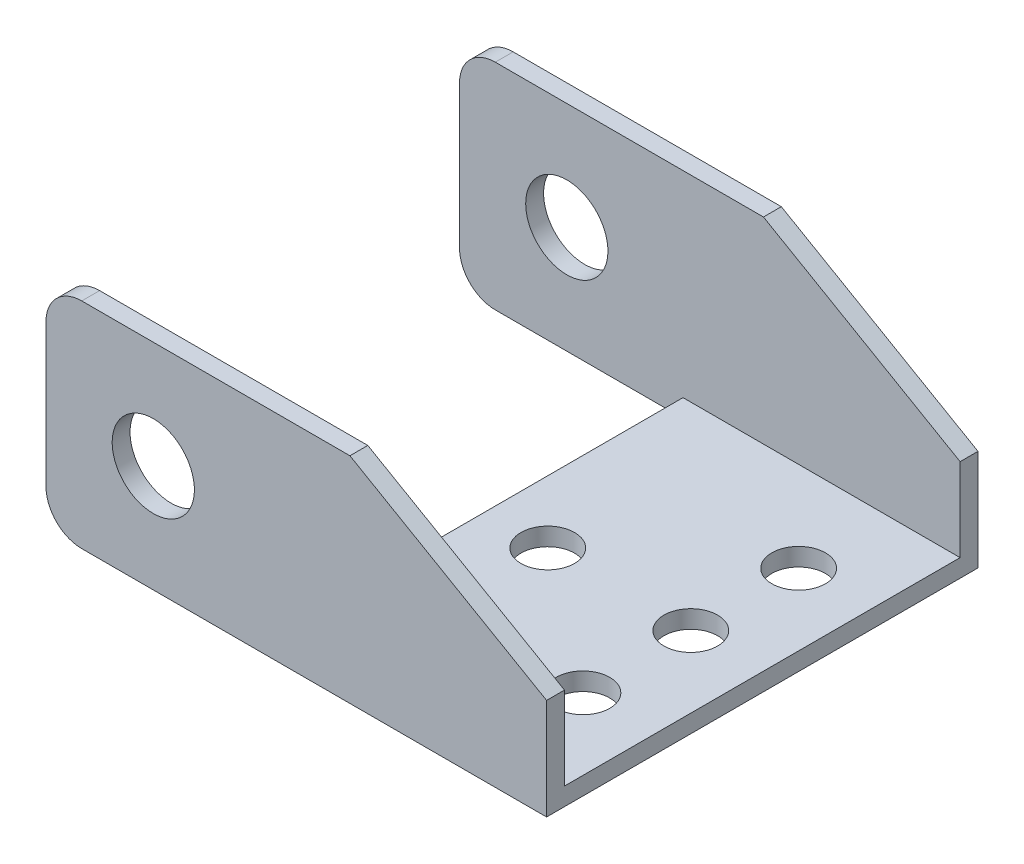
ISO-10303-21;
HEADER;
FILE_DESCRIPTION(('STEP AP214'),'2;1');
FILE_NAME('part.step','',(''),(''),'','','');
FILE_SCHEMA(('AUTOMOTIVE_DESIGN { 1 0 10303 214 1 1 1 1 }'));
ENDSEC;
DATA;
#1=APPLICATION_CONTEXT('core data for automotive mechanical design processes');
#2=APPLICATION_PROTOCOL_DEFINITION('international standard','automotive_design',2000,#1);
#3=PRODUCT_CONTEXT('',#1,'mechanical');
#4=PRODUCT('Part','Part','',(#3));
#5=PRODUCT_RELATED_PRODUCT_CATEGORY('part','',(#4));
#6=PRODUCT_DEFINITION_FORMATION('','',#4);
#7=PRODUCT_DEFINITION_CONTEXT('part definition',#1,'design');
#8=PRODUCT_DEFINITION('design','',#6,#7);
#9=PRODUCT_DEFINITION_SHAPE('','',#8);
#10=(LENGTH_UNIT() NAMED_UNIT(*) SI_UNIT(.MILLI.,.METRE.));
#11=(NAMED_UNIT(*) PLANE_ANGLE_UNIT() SI_UNIT($,.RADIAN.));
#12=(NAMED_UNIT(*) SI_UNIT($,.STERADIAN.) SOLID_ANGLE_UNIT());
#13=UNCERTAINTY_MEASURE_WITH_UNIT(LENGTH_MEASURE(1.E-05),#10,'distance_accuracy_value','');
#14=(GEOMETRIC_REPRESENTATION_CONTEXT(3) GLOBAL_UNCERTAINTY_ASSIGNED_CONTEXT((#13)) GLOBAL_UNIT_ASSIGNED_CONTEXT((#10,
#11,#12)) REPRESENTATION_CONTEXT('',''));
#15=CARTESIAN_POINT('',(0.,0.,0.));
#16=DIRECTION('',(0.,0.,1.));
#17=DIRECTION('',(1.,0.,0.));
#18=AXIS2_PLACEMENT_3D('',#15,#16,#17);
#19=CARTESIAN_POINT('',(0.,0.,12.065));
#20=DIRECTION('',(0.,0.,-1.));
#21=DIRECTION('',(-1.,0.,0.));
#22=AXIS2_PLACEMENT_3D('',#19,#20,#21);
#23=CYLINDRICAL_SURFACE('',#22,2.3);
#24=CARTESIAN_POINT('',(0.,0.,-11.065));
#25=DIRECTION('',(0.,0.,-1.));
#26=DIRECTION('',(-1.,0.,0.));
#27=AXIS2_PLACEMENT_3D('',#24,#25,#26);
#28=CIRCLE('',#27,2.3);
#29=CARTESIAN_POINT('',(-2.3,0.,-11.065));
#30=VERTEX_POINT('',#29);
#31=EDGE_CURVE('E361',#30,#30,#28,.F.);
#32=ORIENTED_EDGE('',*,*,#31,.T.);
#33=EDGE_LOOP('',(#32));
#34=FACE_BOUND('',#33,.T.);
#35=CARTESIAN_POINT('',(0.,0.,-12.065));
#36=DIRECTION('',(0.,0.,-1.));
#37=DIRECTION('',(-1.,0.,0.));
#38=AXIS2_PLACEMENT_3D('',#35,#36,#37);
#39=CIRCLE('',#38,2.3);
#40=CARTESIAN_POINT('',(-2.3,0.,-12.065));
#41=VERTEX_POINT('',#40);
#42=EDGE_CURVE('E264',#41,#41,#39,.F.);
#43=ORIENTED_EDGE('',*,*,#42,.F.);
#44=EDGE_LOOP('',(#43));
#45=FACE_BOUND('',#44,.T.);
#46=ADVANCED_FACE('F14',(#34,#45),#23,.F.);
#47=CARTESIAN_POINT('',(-4.,4.,12.065));
#48=DIRECTION('',(0.,0.,-1.));
#49=DIRECTION('',(-1.,0.,0.));
#50=AXIS2_PLACEMENT_3D('',#47,#48,#49);
#51=CYLINDRICAL_SURFACE('',#50,2.);
#52=CARTESIAN_POINT('',(-4.,4.,-12.065));
#53=DIRECTION('',(0.,0.,-1.));
#54=DIRECTION('',(-1.,0.,0.));
#55=AXIS2_PLACEMENT_3D('',#52,#53,#54);
#56=CIRCLE('',#55,2.);
#57=CARTESIAN_POINT('',(-6.,4.,-12.065));
#58=VERTEX_POINT('',#57);
#59=CARTESIAN_POINT('',(-4.,6.,-12.065));
#60=VERTEX_POINT('',#59);
#61=EDGE_CURVE('E97',#58,#60,#56,.T.);
#62=ORIENTED_EDGE('',*,*,#61,.F.);
#63=DIRECTION('',(0.,0.,-1.));
#64=VECTOR('',#63,1.);
#65=CARTESIAN_POINT('',(-6.,4.,12.065));
#66=LINE('',#65,#64);
#67=CARTESIAN_POINT('',(-6.,4.,-11.065));
#68=VERTEX_POINT('',#67);
#69=EDGE_CURVE('E90',#58,#68,#66,.F.);
#70=ORIENTED_EDGE('',*,*,#69,.T.);
#71=CARTESIAN_POINT('',(-4.,4.,-11.065));
#72=DIRECTION('',(0.,0.,-1.));
#73=DIRECTION('',(-1.,0.,0.));
#74=AXIS2_PLACEMENT_3D('',#71,#72,#73);
#75=CIRCLE('',#74,2.);
#76=CARTESIAN_POINT('',(-4.,6.,-11.065));
#77=VERTEX_POINT('',#76);
#78=EDGE_CURVE('E359',#68,#77,#75,.T.);
#79=ORIENTED_EDGE('',*,*,#78,.T.);
#80=DIRECTION('',(0.,0.,-1.));
#81=VECTOR('',#80,1.);
#82=CARTESIAN_POINT('',(-4.,6.,12.065));
#83=LINE('',#82,#81);
#84=EDGE_CURVE('E255',#77,#60,#83,.T.);
#85=ORIENTED_EDGE('',*,*,#84,.T.);
#86=EDGE_LOOP('',(#62,#70,#79,#85));
#87=FACE_BOUND('',#86,.T.);
#88=ADVANCED_FACE('F246',(#87),#51,.T.);
#89=CARTESIAN_POINT('',(-6.,6.,12.065));
#90=DIRECTION('',(0.,-1.,0.));
#91=DIRECTION('',(0.,0.,-1.));
#92=AXIS2_PLACEMENT_3D('',#89,#90,#91);
#93=PLANE('',#92);
#94=ORIENTED_EDGE('',*,*,#84,.F.);
#95=DIRECTION('',(-1.,0.,0.));
#96=VECTOR('',#95,1.);
#97=CARTESIAN_POINT('',(-6.,6.,-11.065));
#98=LINE('',#97,#96);
#99=CARTESIAN_POINT('',(11.,6.00000000000001,-11.065));
#100=VERTEX_POINT('',#99);
#101=EDGE_CURVE('E329',#77,#100,#98,.F.);
#102=ORIENTED_EDGE('',*,*,#101,.T.);
#103=DIRECTION('',(0.,0.,1.));
#104=VECTOR('',#103,1.);
#105=CARTESIAN_POINT('',(11.,6.,12.065));
#106=LINE('',#105,#104);
#107=CARTESIAN_POINT('',(11.,6.,-12.065));
#108=VERTEX_POINT('',#107);
#109=EDGE_CURVE('E319',#100,#108,#106,.F.);
#110=ORIENTED_EDGE('',*,*,#109,.T.);
#111=DIRECTION('',(-1.,0.,0.));
#112=VECTOR('',#111,1.);
#113=CARTESIAN_POINT('',(0.,6.,-12.065));
#114=LINE('',#113,#112);
#115=EDGE_CURVE('E101',#60,#108,#114,.F.);
#116=ORIENTED_EDGE('',*,*,#115,.F.);
#117=EDGE_LOOP('',(#94,#102,#110,#116));
#118=FACE_BOUND('',#117,.T.);
#119=ADVANCED_FACE('F243',(#118),#93,.F.);
#120=CARTESIAN_POINT('',(11.,6.,12.065));
#121=DIRECTION('',(-0.500000000000001,-0.866025403784438,0.));
#122=DIRECTION('',(0.866025403784438,-0.500000000000001,0.));
#123=AXIS2_PLACEMENT_3D('',#120,#121,#122);
#124=PLANE('',#123);
#125=DIRECTION('',(0.866025403784438,-0.500000000000001,0.));
#126=VECTOR('',#125,1.);
#127=CARTESIAN_POINT('',(11.,6.,-11.065));
#128=LINE('',#127,#126);
#129=CARTESIAN_POINT('',(22.,-0.350852961085902,-11.065));
#130=VERTEX_POINT('',#129);
#131=EDGE_CURVE('E324',#100,#130,#128,.T.);
#132=ORIENTED_EDGE('',*,*,#131,.T.);
#133=DIRECTION('',(0.,0.,1.));
#134=VECTOR('',#133,1.);
#135=CARTESIAN_POINT('',(22.,-0.350852961085901,12.065));
#136=LINE('',#135,#134);
#137=CARTESIAN_POINT('',(22.,-0.350852961085902,-12.065));
#138=VERTEX_POINT('',#137);
#139=EDGE_CURVE('E260',#130,#138,#136,.F.);
#140=ORIENTED_EDGE('',*,*,#139,.T.);
#141=DIRECTION('',(0.866025403784438,-0.500000000000001,0.));
#142=VECTOR('',#141,1.);
#143=CARTESIAN_POINT('',(11.,6.,-12.065));
#144=LINE('',#143,#142);
#145=EDGE_CURVE('E258',#108,#138,#144,.T.);
#146=ORIENTED_EDGE('',*,*,#145,.F.);
#147=ORIENTED_EDGE('',*,*,#109,.F.);
#148=EDGE_LOOP('',(#132,#140,#146,#147));
#149=FACE_BOUND('',#148,.T.);
#150=ADVANCED_FACE('F240',(#149),#124,.F.);
#151=CARTESIAN_POINT('',(-6.,-6.,12.065));
#152=DIRECTION('',(1.,0.,0.));
#153=DIRECTION('',(0.,0.,-1.));
#154=AXIS2_PLACEMENT_3D('',#151,#152,#153);
#155=PLANE('',#154);
#156=DIRECTION('',(0.,0.,-1.));
#157=VECTOR('',#156,1.);
#158=CARTESIAN_POINT('',(-6.,-4.,12.065));
#159=LINE('',#158,#157);
#160=CARTESIAN_POINT('',(-6.,-4.,-11.065));
#161=VERTEX_POINT('',#160);
#162=CARTESIAN_POINT('',(-6.,-4.,-12.065));
#163=VERTEX_POINT('',#162);
#164=EDGE_CURVE('E320',#161,#163,#159,.T.);
#165=ORIENTED_EDGE('',*,*,#164,.F.);
#166=DIRECTION('',(0.,1.,0.));
#167=VECTOR('',#166,1.);
#168=CARTESIAN_POINT('',(-6.,-6.,-11.065));
#169=LINE('',#168,#167);
#170=EDGE_CURVE('E358',#161,#68,#169,.T.);
#171=ORIENTED_EDGE('',*,*,#170,.T.);
#172=ORIENTED_EDGE('',*,*,#69,.F.);
#173=DIRECTION('',(0.,1.,0.));
#174=VECTOR('',#173,1.);
#175=CARTESIAN_POINT('',(-6.,0.,-12.065));
#176=LINE('',#175,#174);
#177=EDGE_CURVE('E256',#163,#58,#176,.T.);
#178=ORIENTED_EDGE('',*,*,#177,.F.);
#179=EDGE_LOOP('',(#165,#171,#172,#178));
#180=FACE_BOUND('',#179,.T.);
#181=ADVANCED_FACE('F236',(#180),#155,.F.);
#182=CARTESIAN_POINT('',(22.,-5.,-11.065));
#183=DIRECTION('',(0.,-1.,0.));
#184=DIRECTION('',(0.,0.,-1.));
#185=AXIS2_PLACEMENT_3D('',#182,#183,#184);
#186=PLANE('',#185);
#187=CARTESIAN_POINT('',(10.,-5.,0.));
#188=DIRECTION('',(0.,1.,0.));
#189=DIRECTION('',(0.,0.,1.));
#190=AXIS2_PLACEMENT_3D('',#187,#188,#189);
#191=CIRCLE('',#190,1.5);
#192=CARTESIAN_POINT('',(10.,-5.,1.5));
#193=VERTEX_POINT('',#192);
#194=EDGE_CURVE('E266',#193,#193,#191,.F.);
#195=ORIENTED_EDGE('',*,*,#194,.T.);
#196=EDGE_LOOP('',(#195));
#197=FACE_BOUND('',#196,.T.);
#198=CARTESIAN_POINT('',(18.,-5.,-6.0325));
#199=DIRECTION('',(0.,1.,0.));
#200=DIRECTION('',(0.,0.,1.));
#201=AXIS2_PLACEMENT_3D('',#198,#199,#200);
#202=CIRCLE('',#201,1.5);
#203=CARTESIAN_POINT('',(18.,-5.,-4.5325));
#204=VERTEX_POINT('',#203);
#205=EDGE_CURVE('E271',#204,#204,#202,.F.);
#206=ORIENTED_EDGE('',*,*,#205,.T.);
#207=EDGE_LOOP('',(#206));
#208=FACE_BOUND('',#207,.T.);
#209=DIRECTION('',(1.,0.,0.));
#210=VECTOR('',#209,1.);
#211=CARTESIAN_POINT('',(-6.,-5.,11.065));
#212=LINE('',#211,#210);
#213=CARTESIAN_POINT('',(6.50000000000001,-5.,11.065));
#214=VERTEX_POINT('',#213);
#215=CARTESIAN_POINT('',(22.,-5.,11.065));
#216=VERTEX_POINT('',#215);
#217=EDGE_CURVE('E305',#214,#216,#212,.T.);
#218=ORIENTED_EDGE('',*,*,#217,.T.);
#219=DIRECTION('',(0.,0.,1.));
#220=VECTOR('',#219,1.);
#221=CARTESIAN_POINT('',(22.,-5.,12.065));
#222=LINE('',#221,#220);
#223=CARTESIAN_POINT('',(22.,-5.,-11.065));
#224=VERTEX_POINT('',#223);
#225=EDGE_CURVE('E295',#216,#224,#222,.F.);
#226=ORIENTED_EDGE('',*,*,#225,.T.);
#227=DIRECTION('',(-1.,0.,0.));
#228=VECTOR('',#227,1.);
#229=CARTESIAN_POINT('',(-6.,-5.,-11.065));
#230=LINE('',#229,#228);
#231=CARTESIAN_POINT('',(6.50000000000001,-5.,-11.065));
#232=VERTEX_POINT('',#231);
#233=EDGE_CURVE('E314',#224,#232,#230,.T.);
#234=ORIENTED_EDGE('',*,*,#233,.T.);
#235=DIRECTION('',(0.,0.,-1.));
#236=VECTOR('',#235,1.);
#237=CARTESIAN_POINT('',(6.50000000000001,-5.,11.065));
#238=LINE('',#237,#236);
#239=EDGE_CURVE('E310',#232,#214,#238,.F.);
#240=ORIENTED_EDGE('',*,*,#239,.T.);
#241=EDGE_LOOP('',(#218,#226,#234,#240));
#242=FACE_BOUND('',#241,.T.);
#243=CARTESIAN_POINT('',(18.,-5.,6.0325));
#244=DIRECTION('',(0.,1.,0.));
#245=DIRECTION('',(0.,0.,1.));
#246=AXIS2_PLACEMENT_3D('',#243,#244,#245);
#247=CIRCLE('',#246,1.5);
#248=CARTESIAN_POINT('',(18.,-5.,7.5325));
#249=VERTEX_POINT('',#248);
#250=EDGE_CURVE('E17',#249,#249,#247,.F.);
#251=ORIENTED_EDGE('',*,*,#250,.T.);
#252=EDGE_LOOP('',(#251));
#253=FACE_BOUND('',#252,.T.);
#254=CARTESIAN_POINT('',(18.,-5.,0.));
#255=DIRECTION('',(0.,1.,0.));
#256=DIRECTION('',(0.,0.,1.));
#257=AXIS2_PLACEMENT_3D('',#254,#255,#256);
#258=CIRCLE('',#257,1.5);
#259=CARTESIAN_POINT('',(18.,-5.,1.5));
#260=VERTEX_POINT('',#259);
#261=EDGE_CURVE('E269',#260,#260,#258,.F.);
#262=ORIENTED_EDGE('',*,*,#261,.T.);
#263=EDGE_LOOP('',(#262));
#264=FACE_BOUND('',#263,.T.);
#265=ADVANCED_FACE('F232',(#197,#208,#242,#253,#264),#186,.F.);
#266=CARTESIAN_POINT('',(-4.,4.,12.065));
#267=DIRECTION('',(0.,0.,-1.));
#268=DIRECTION('',(-1.,0.,0.));
#269=AXIS2_PLACEMENT_3D('',#266,#267,#268);
#270=CYLINDRICAL_SURFACE('',#269,2.);
#271=CARTESIAN_POINT('',(-4.,4.,11.065));
#272=DIRECTION('',(0.,0.,-1.));
#273=DIRECTION('',(-1.,0.,0.));
#274=AXIS2_PLACEMENT_3D('',#271,#272,#273);
#275=CIRCLE('',#274,2.);
#276=CARTESIAN_POINT('',(-4.,6.,11.065));
#277=VERTEX_POINT('',#276);
#278=CARTESIAN_POINT('',(-6.,4.,11.065));
#279=VERTEX_POINT('',#278);
#280=EDGE_CURVE('E352',#277,#279,#275,.F.);
#281=ORIENTED_EDGE('',*,*,#280,.T.);
#282=DIRECTION('',(0.,0.,-1.));
#283=VECTOR('',#282,1.);
#284=CARTESIAN_POINT('',(-6.,4.,12.065));
#285=LINE('',#284,#283);
#286=CARTESIAN_POINT('',(-6.,4.,12.065));
#287=VERTEX_POINT('',#286);
#288=EDGE_CURVE('E276',#279,#287,#285,.F.);
#289=ORIENTED_EDGE('',*,*,#288,.T.);
#290=CARTESIAN_POINT('',(-4.,4.,12.065));
#291=DIRECTION('',(0.,0.,-1.));
#292=DIRECTION('',(-1.,0.,0.));
#293=AXIS2_PLACEMENT_3D('',#290,#291,#292);
#294=CIRCLE('',#293,2.);
#295=CARTESIAN_POINT('',(-4.,6.,12.065));
#296=VERTEX_POINT('',#295);
#297=EDGE_CURVE('E349',#287,#296,#294,.T.);
#298=ORIENTED_EDGE('',*,*,#297,.T.);
#299=DIRECTION('',(0.,0.,-1.));
#300=VECTOR('',#299,1.);
#301=CARTESIAN_POINT('',(-4.,6.,12.065));
#302=LINE('',#301,#300);
#303=EDGE_CURVE('E285',#296,#277,#302,.T.);
#304=ORIENTED_EDGE('',*,*,#303,.T.);
#305=EDGE_LOOP('',(#281,#289,#298,#304));
#306=FACE_BOUND('',#305,.T.);
#307=ADVANCED_FACE('F228',(#306),#270,.T.);
#308=CARTESIAN_POINT('',(-6.,6.,12.065));
#309=DIRECTION('',(0.,-1.,0.));
#310=DIRECTION('',(0.,0.,-1.));
#311=AXIS2_PLACEMENT_3D('',#308,#309,#310);
#312=PLANE('',#311);
#313=ORIENTED_EDGE('',*,*,#303,.F.);
#314=DIRECTION('',(-1.,0.,0.));
#315=VECTOR('',#314,1.);
#316=CARTESIAN_POINT('',(0.,6.,12.065));
#317=LINE('',#316,#315);
#318=CARTESIAN_POINT('',(11.,6.,12.065));
#319=VERTEX_POINT('',#318);
#320=EDGE_CURVE('E296',#296,#319,#317,.F.);
#321=ORIENTED_EDGE('',*,*,#320,.T.);
#322=DIRECTION('',(0.,0.,1.));
#323=VECTOR('',#322,1.);
#324=CARTESIAN_POINT('',(11.,6.,12.065));
#325=LINE('',#324,#323);
#326=CARTESIAN_POINT('',(11.,6.,11.065));
#327=VERTEX_POINT('',#326);
#328=EDGE_CURVE('E280',#319,#327,#325,.F.);
#329=ORIENTED_EDGE('',*,*,#328,.T.);
#330=DIRECTION('',(1.,0.,0.));
#331=VECTOR('',#330,1.);
#332=CARTESIAN_POINT('',(-6.,6.,11.065));
#333=LINE('',#332,#331);
#334=EDGE_CURVE('E302',#327,#277,#333,.F.);
#335=ORIENTED_EDGE('',*,*,#334,.T.);
#336=EDGE_LOOP('',(#313,#321,#329,#335));
#337=FACE_BOUND('',#336,.T.);
#338=ADVANCED_FACE('F224',(#337),#312,.F.);
#339=CARTESIAN_POINT('',(11.,6.,12.065));
#340=DIRECTION('',(-0.500000000000001,-0.866025403784438,0.));
#341=DIRECTION('',(0.866025403784438,-0.500000000000001,0.));
#342=AXIS2_PLACEMENT_3D('',#339,#340,#341);
#343=PLANE('',#342);
#344=DIRECTION('',(-0.866025403784438,0.500000000000001,0.));
#345=VECTOR('',#344,1.);
#346=CARTESIAN_POINT('',(22.,-0.350852961085901,11.065));
#347=LINE('',#346,#345);
#348=CARTESIAN_POINT('',(22.,-0.350852961085902,11.065));
#349=VERTEX_POINT('',#348);
#350=EDGE_CURVE('E299',#349,#327,#347,.T.);
#351=ORIENTED_EDGE('',*,*,#350,.T.);
#352=ORIENTED_EDGE('',*,*,#328,.F.);
#353=DIRECTION('',(0.866025403784438,-0.500000000000001,0.));
#354=VECTOR('',#353,1.);
#355=CARTESIAN_POINT('',(11.,6.,12.065));
#356=LINE('',#355,#354);
#357=CARTESIAN_POINT('',(22.,-0.350852961085902,12.065));
#358=VERTEX_POINT('',#357);
#359=EDGE_CURVE('E158',#319,#358,#356,.T.);
#360=ORIENTED_EDGE('',*,*,#359,.T.);
#361=DIRECTION('',(0.,0.,1.));
#362=VECTOR('',#361,1.);
#363=CARTESIAN_POINT('',(22.,-0.350852961085901,12.065));
#364=LINE('',#363,#362);
#365=EDGE_CURVE('E155',#358,#349,#364,.F.);
#366=ORIENTED_EDGE('',*,*,#365,.T.);
#367=EDGE_LOOP('',(#351,#352,#360,#366));
#368=FACE_BOUND('',#367,.T.);
#369=ADVANCED_FACE('F220',(#368),#343,.F.);
#370=CARTESIAN_POINT('',(-6.,-6.,12.065));
#371=DIRECTION('',(1.,0.,0.));
#372=DIRECTION('',(0.,0.,-1.));
#373=AXIS2_PLACEMENT_3D('',#370,#371,#372);
#374=PLANE('',#373);
#375=DIRECTION('',(0.,0.,-1.));
#376=VECTOR('',#375,1.);
#377=CARTESIAN_POINT('',(-6.,-4.,12.065));
#378=LINE('',#377,#376);
#379=CARTESIAN_POINT('',(-6.,-4.,12.065));
#380=VERTEX_POINT('',#379);
#381=CARTESIAN_POINT('',(-6.,-4.,11.065));
#382=VERTEX_POINT('',#381);
#383=EDGE_CURVE('E290',#380,#382,#378,.T.);
#384=ORIENTED_EDGE('',*,*,#383,.F.);
#385=DIRECTION('',(0.,1.,0.));
#386=VECTOR('',#385,1.);
#387=CARTESIAN_POINT('',(-6.,0.,12.065));
#388=LINE('',#387,#386);
#389=EDGE_CURVE('E347',#380,#287,#388,.T.);
#390=ORIENTED_EDGE('',*,*,#389,.T.);
#391=ORIENTED_EDGE('',*,*,#288,.F.);
#392=DIRECTION('',(0.,1.,0.));
#393=VECTOR('',#392,1.);
#394=CARTESIAN_POINT('',(-6.,-6.,11.065));
#395=LINE('',#394,#393);
#396=EDGE_CURVE('E293',#279,#382,#395,.F.);
#397=ORIENTED_EDGE('',*,*,#396,.T.);
#398=EDGE_LOOP('',(#384,#390,#391,#397));
#399=FACE_BOUND('',#398,.T.);
#400=ADVANCED_FACE('F216',(#399),#374,.F.);
#401=CARTESIAN_POINT('',(0.,0.,12.065));
#402=DIRECTION('',(0.,0.,-1.));
#403=DIRECTION('',(-1.,0.,0.));
#404=AXIS2_PLACEMENT_3D('',#401,#402,#403);
#405=CYLINDRICAL_SURFACE('',#404,2.3);
#406=CARTESIAN_POINT('',(0.,0.,11.065));
#407=DIRECTION('',(0.,0.,-1.));
#408=DIRECTION('',(-1.,0.,0.));
#409=AXIS2_PLACEMENT_3D('',#406,#407,#408);
#410=CIRCLE('',#409,2.3);
#411=CARTESIAN_POINT('',(-2.3,0.,11.065));
#412=VERTEX_POINT('',#411);
#413=EDGE_CURVE('E312',#412,#412,#410,.T.);
#414=ORIENTED_EDGE('',*,*,#413,.T.);
#415=EDGE_LOOP('',(#414));
#416=FACE_BOUND('',#415,.T.);
#417=CARTESIAN_POINT('',(0.,0.,12.065));
#418=DIRECTION('',(0.,0.,-1.));
#419=DIRECTION('',(-1.,0.,0.));
#420=AXIS2_PLACEMENT_3D('',#417,#418,#419);
#421=CIRCLE('',#420,2.3);
#422=CARTESIAN_POINT('',(-2.3,0.,12.065));
#423=VERTEX_POINT('',#422);
#424=EDGE_CURVE('E344',#423,#423,#421,.F.);
#425=ORIENTED_EDGE('',*,*,#424,.T.);
#426=EDGE_LOOP('',(#425));
#427=FACE_BOUND('',#426,.T.);
#428=ADVANCED_FACE('F212',(#416,#427),#405,.F.);
#429=CARTESIAN_POINT('',(18.,-6.,6.0325));
#430=DIRECTION('',(0.,1.,0.));
#431=DIRECTION('',(0.,0.,1.));
#432=AXIS2_PLACEMENT_3D('',#429,#430,#431);
#433=CYLINDRICAL_SURFACE('',#432,1.5);
#434=CARTESIAN_POINT('',(18.,-6.,6.0325));
#435=DIRECTION('',(0.,1.,0.));
#436=DIRECTION('',(0.,0.,1.));
#437=AXIS2_PLACEMENT_3D('',#434,#435,#436);
#438=CIRCLE('',#437,1.5);
#439=CARTESIAN_POINT('',(18.,-6.,7.5325));
#440=VERTEX_POINT('',#439);
#441=EDGE_CURVE('E341',#440,#440,#438,.F.);
#442=ORIENTED_EDGE('',*,*,#441,.T.);
#443=EDGE_LOOP('',(#442));
#444=FACE_BOUND('',#443,.T.);
#445=ORIENTED_EDGE('',*,*,#250,.F.);
#446=EDGE_LOOP('',(#445));
#447=FACE_BOUND('',#446,.T.);
#448=ADVANCED_FACE('F208',(#444,#447),#433,.F.);
#449=CARTESIAN_POINT('',(18.,-6.,-6.0325));
#450=DIRECTION('',(0.,1.,0.));
#451=DIRECTION('',(0.,0.,1.));
#452=AXIS2_PLACEMENT_3D('',#449,#450,#451);
#453=CYLINDRICAL_SURFACE('',#452,1.5);
#454=CARTESIAN_POINT('',(18.,-6.,-6.0325));
#455=DIRECTION('',(0.,1.,0.));
#456=DIRECTION('',(0.,0.,1.));
#457=AXIS2_PLACEMENT_3D('',#454,#455,#456);
#458=CIRCLE('',#457,1.5);
#459=CARTESIAN_POINT('',(18.,-6.,-4.5325));
#460=VERTEX_POINT('',#459);
#461=EDGE_CURVE('E338',#460,#460,#458,.F.);
#462=ORIENTED_EDGE('',*,*,#461,.T.);
#463=EDGE_LOOP('',(#462));
#464=FACE_BOUND('',#463,.T.);
#465=ORIENTED_EDGE('',*,*,#205,.F.);
#466=EDGE_LOOP('',(#465));
#467=FACE_BOUND('',#466,.T.);
#468=ADVANCED_FACE('F204',(#464,#467),#453,.F.);
#469=CARTESIAN_POINT('',(18.,-6.,0.));
#470=DIRECTION('',(0.,1.,0.));
#471=DIRECTION('',(0.,0.,1.));
#472=AXIS2_PLACEMENT_3D('',#469,#470,#471);
#473=CYLINDRICAL_SURFACE('',#472,1.5);
#474=CARTESIAN_POINT('',(18.,-6.,0.));
#475=DIRECTION('',(0.,1.,0.));
#476=DIRECTION('',(0.,0.,1.));
#477=AXIS2_PLACEMENT_3D('',#474,#475,#476);
#478=CIRCLE('',#477,1.5);
#479=CARTESIAN_POINT('',(18.,-6.,1.5));
#480=VERTEX_POINT('',#479);
#481=EDGE_CURVE('E335',#480,#480,#478,.F.);
#482=ORIENTED_EDGE('',*,*,#481,.T.);
#483=EDGE_LOOP('',(#482));
#484=FACE_BOUND('',#483,.T.);
#485=ORIENTED_EDGE('',*,*,#261,.F.);
#486=EDGE_LOOP('',(#485));
#487=FACE_BOUND('',#486,.T.);
#488=ADVANCED_FACE('F200',(#484,#487),#473,.F.);
#489=CARTESIAN_POINT('',(10.,-6.,0.));
#490=DIRECTION('',(0.,1.,0.));
#491=DIRECTION('',(0.,0.,1.));
#492=AXIS2_PLACEMENT_3D('',#489,#490,#491);
#493=CYLINDRICAL_SURFACE('',#492,1.5);
#494=CARTESIAN_POINT('',(10.,-6.,0.));
#495=DIRECTION('',(0.,1.,0.));
#496=DIRECTION('',(0.,0.,1.));
#497=AXIS2_PLACEMENT_3D('',#494,#495,#496);
#498=CIRCLE('',#497,1.5);
#499=CARTESIAN_POINT('',(10.,-6.,1.5));
#500=VERTEX_POINT('',#499);
#501=EDGE_CURVE('E148',#500,#500,#498,.F.);
#502=ORIENTED_EDGE('',*,*,#501,.T.);
#503=EDGE_LOOP('',(#502));
#504=FACE_BOUND('',#503,.T.);
#505=ORIENTED_EDGE('',*,*,#194,.F.);
#506=EDGE_LOOP('',(#505));
#507=FACE_BOUND('',#506,.T.);
#508=ADVANCED_FACE('F197',(#504,#507),#493,.F.);
#509=CARTESIAN_POINT('',(22.,-0.350852961085901,12.065));
#510=DIRECTION('',(-1.,0.,0.));
#511=DIRECTION('',(0.,-1.,0.));
#512=AXIS2_PLACEMENT_3D('',#509,#510,#511);
#513=PLANE('',#512);
#514=DIRECTION('',(0.,1.,0.));
#515=VECTOR('',#514,1.);
#516=CARTESIAN_POINT('',(22.,-6.,-11.065));
#517=LINE('',#516,#515);
#518=EDGE_CURVE('E317',#130,#224,#517,.F.);
#519=ORIENTED_EDGE('',*,*,#518,.T.);
#520=ORIENTED_EDGE('',*,*,#225,.F.);
#521=DIRECTION('',(0.,1.,0.));
#522=VECTOR('',#521,1.);
#523=CARTESIAN_POINT('',(22.,-6.,11.065));
#524=LINE('',#523,#522);
#525=EDGE_CURVE('E303',#216,#349,#524,.T.);
#526=ORIENTED_EDGE('',*,*,#525,.T.);
#527=ORIENTED_EDGE('',*,*,#365,.F.);
#528=DIRECTION('',(0.,1.,0.));
#529=VECTOR('',#528,1.);
#530=CARTESIAN_POINT('',(22.,0.,12.065));
#531=LINE('',#530,#529);
#532=CARTESIAN_POINT('',(22.,-6.,12.065));
#533=VERTEX_POINT('',#532);
#534=EDGE_CURVE('E151',#358,#533,#531,.F.);
#535=ORIENTED_EDGE('',*,*,#534,.T.);
#536=DIRECTION('',(0.,0.,1.));
#537=VECTOR('',#536,1.);
#538=CARTESIAN_POINT('',(22.,-6.,12.065));
#539=LINE('',#538,#537);
#540=CARTESIAN_POINT('',(22.,-6.,-12.065));
#541=VERTEX_POINT('',#540);
#542=EDGE_CURVE('E137',#533,#541,#539,.F.);
#543=ORIENTED_EDGE('',*,*,#542,.T.);
#544=DIRECTION('',(0.,1.,0.));
#545=VECTOR('',#544,1.);
#546=CARTESIAN_POINT('',(22.,0.,-12.065));
#547=LINE('',#546,#545);
#548=EDGE_CURVE('E289',#138,#541,#547,.F.);
#549=ORIENTED_EDGE('',*,*,#548,.F.);
#550=ORIENTED_EDGE('',*,*,#139,.F.);
#551=EDGE_LOOP('',(#519,#520,#526,#527,#535,#543,#549,#550));
#552=FACE_BOUND('',#551,.T.);
#553=ADVANCED_FACE('F153',(#552),#513,.F.);
#554=CARTESIAN_POINT('',(0.,0.,-12.065));
#555=DIRECTION('',(0.,0.,-1.));
#556=DIRECTION('',(-1.,0.,0.));
#557=AXIS2_PLACEMENT_3D('',#554,#555,#556);
#558=PLANE('',#557);
#559=ORIENTED_EDGE('',*,*,#42,.T.);
#560=EDGE_LOOP('',(#559));
#561=FACE_BOUND('',#560,.T.);
#562=ORIENTED_EDGE('',*,*,#145,.T.);
#563=ORIENTED_EDGE('',*,*,#548,.T.);
#564=DIRECTION('',(-1.,0.,0.));
#565=VECTOR('',#564,1.);
#566=CARTESIAN_POINT('',(22.,-6.,-12.065));
#567=LINE('',#566,#565);
#568=CARTESIAN_POINT('',(-4.,-6.,-12.065));
#569=VERTEX_POINT('',#568);
#570=EDGE_CURVE('E145',#541,#569,#567,.T.);
#571=ORIENTED_EDGE('',*,*,#570,.T.);
#572=CARTESIAN_POINT('',(-4.,-4.,-12.065));
#573=DIRECTION('',(0.,0.,-1.));
#574=DIRECTION('',(-1.,0.,0.));
#575=AXIS2_PLACEMENT_3D('',#572,#573,#574);
#576=CIRCLE('',#575,2.);
#577=EDGE_CURVE('E322',#163,#569,#576,.F.);
#578=ORIENTED_EDGE('',*,*,#577,.F.);
#579=ORIENTED_EDGE('',*,*,#177,.T.);
#580=ORIENTED_EDGE('',*,*,#61,.T.);
#581=ORIENTED_EDGE('',*,*,#115,.T.);
#582=EDGE_LOOP('',(#562,#563,#571,#578,#579,#580,#581));
#583=FACE_BOUND('',#582,.T.);
#584=ADVANCED_FACE('F190',(#561,#583),#558,.T.);
#585=CARTESIAN_POINT('',(-4.,-4.,12.065));
#586=DIRECTION('',(0.,0.,-1.));
#587=DIRECTION('',(-1.,0.,0.));
#588=AXIS2_PLACEMENT_3D('',#585,#586,#587);
#589=CYLINDRICAL_SURFACE('',#588,2.);
#590=ORIENTED_EDGE('',*,*,#577,.T.);
#591=DIRECTION('',(0.,0.,1.));
#592=VECTOR('',#591,1.);
#593=CARTESIAN_POINT('',(-4.,-6.,12.065));
#594=LINE('',#593,#592);
#595=CARTESIAN_POINT('',(-4.,-6.,-11.065));
#596=VERTEX_POINT('',#595);
#597=EDGE_CURVE('E365',#569,#596,#594,.T.);
#598=ORIENTED_EDGE('',*,*,#597,.T.);
#599=CARTESIAN_POINT('',(-4.,-4.,-11.065));
#600=DIRECTION('',(0.,0.,-1.));
#601=DIRECTION('',(-1.,0.,0.));
#602=AXIS2_PLACEMENT_3D('',#599,#600,#601);
#603=CIRCLE('',#602,2.);
#604=EDGE_CURVE('E316',#596,#161,#603,.T.);
#605=ORIENTED_EDGE('',*,*,#604,.T.);
#606=ORIENTED_EDGE('',*,*,#164,.T.);
#607=EDGE_LOOP('',(#590,#598,#605,#606));
#608=FACE_BOUND('',#607,.T.);
#609=ADVANCED_FACE('F186',(#608),#589,.T.);
#610=CARTESIAN_POINT('',(-6.,-6.,-11.065));
#611=DIRECTION('',(0.,0.,-1.));
#612=DIRECTION('',(-1.,0.,0.));
#613=AXIS2_PLACEMENT_3D('',#610,#611,#612);
#614=PLANE('',#613);
#615=ORIENTED_EDGE('',*,*,#604,.F.);
#616=DIRECTION('',(-1.,0.,0.));
#617=VECTOR('',#616,1.);
#618=CARTESIAN_POINT('',(22.,-6.,-11.065));
#619=LINE('',#618,#617);
#620=CARTESIAN_POINT('',(6.50000000000001,-6.,-11.065));
#621=VERTEX_POINT('',#620);
#622=EDGE_CURVE('E369',#596,#621,#619,.F.);
#623=ORIENTED_EDGE('',*,*,#622,.T.);
#624=DIRECTION('',(0.,1.,0.));
#625=VECTOR('',#624,1.);
#626=CARTESIAN_POINT('',(6.50000000000001,-6.,-11.065));
#627=LINE('',#626,#625);
#628=EDGE_CURVE('E313',#621,#232,#627,.T.);
#629=ORIENTED_EDGE('',*,*,#628,.T.);
#630=ORIENTED_EDGE('',*,*,#233,.F.);
#631=ORIENTED_EDGE('',*,*,#518,.F.);
#632=ORIENTED_EDGE('',*,*,#131,.F.);
#633=ORIENTED_EDGE('',*,*,#101,.F.);
#634=ORIENTED_EDGE('',*,*,#78,.F.);
#635=ORIENTED_EDGE('',*,*,#170,.F.);
#636=EDGE_LOOP('',(#615,#623,#629,#630,#631,#632,#633,#634,#635));
#637=FACE_BOUND('',#636,.T.);
#638=ORIENTED_EDGE('',*,*,#31,.F.);
#639=EDGE_LOOP('',(#638));
#640=FACE_BOUND('',#639,.T.);
#641=ADVANCED_FACE('F182',(#637,#640),#614,.F.);
#642=CARTESIAN_POINT('',(6.50000000000001,-6.,11.065));
#643=DIRECTION('',(1.,0.,0.));
#644=DIRECTION('',(0.,0.,-1.));
#645=AXIS2_PLACEMENT_3D('',#642,#643,#644);
#646=PLANE('',#645);
#647=ORIENTED_EDGE('',*,*,#239,.F.);
#648=ORIENTED_EDGE('',*,*,#628,.F.);
#649=DIRECTION('',(0.,0.,1.));
#650=VECTOR('',#649,1.);
#651=CARTESIAN_POINT('',(6.50000000000001,-6.,12.065));
#652=LINE('',#651,#650);
#653=CARTESIAN_POINT('',(6.50000000000001,-6.,11.065));
#654=VERTEX_POINT('',#653);
#655=EDGE_CURVE('E377',#621,#654,#652,.T.);
#656=ORIENTED_EDGE('',*,*,#655,.T.);
#657=DIRECTION('',(0.,1.,0.));
#658=VECTOR('',#657,1.);
#659=CARTESIAN_POINT('',(6.50000000000001,-6.,11.065));
#660=LINE('',#659,#658);
#661=EDGE_CURVE('E309',#654,#214,#660,.T.);
#662=ORIENTED_EDGE('',*,*,#661,.T.);
#663=EDGE_LOOP('',(#647,#648,#656,#662));
#664=FACE_BOUND('',#663,.T.);
#665=ADVANCED_FACE('F178',(#664),#646,.F.);
#666=CARTESIAN_POINT('',(-6.,-6.,11.065));
#667=DIRECTION('',(0.,0.,1.));
#668=DIRECTION('',(1.,0.,0.));
#669=AXIS2_PLACEMENT_3D('',#666,#667,#668);
#670=PLANE('',#669);
#671=CARTESIAN_POINT('',(-4.,-4.,11.065));
#672=DIRECTION('',(0.,0.,-1.));
#673=DIRECTION('',(-1.,0.,0.));
#674=AXIS2_PLACEMENT_3D('',#671,#672,#673);
#675=CIRCLE('',#674,2.);
#676=CARTESIAN_POINT('',(-4.,-6.,11.065));
#677=VERTEX_POINT('',#676);
#678=EDGE_CURVE('E292',#382,#677,#675,.F.);
#679=ORIENTED_EDGE('',*,*,#678,.F.);
#680=ORIENTED_EDGE('',*,*,#396,.F.);
#681=ORIENTED_EDGE('',*,*,#280,.F.);
#682=ORIENTED_EDGE('',*,*,#334,.F.);
#683=ORIENTED_EDGE('',*,*,#350,.F.);
#684=ORIENTED_EDGE('',*,*,#525,.F.);
#685=ORIENTED_EDGE('',*,*,#217,.F.);
#686=ORIENTED_EDGE('',*,*,#661,.F.);
#687=DIRECTION('',(-1.,0.,0.));
#688=VECTOR('',#687,1.);
#689=CARTESIAN_POINT('',(22.,-6.,11.065));
#690=LINE('',#689,#688);
#691=EDGE_CURVE('E382',#654,#677,#690,.T.);
#692=ORIENTED_EDGE('',*,*,#691,.T.);
#693=EDGE_LOOP('',(#679,#680,#681,#682,#683,#684,#685,#686,#692));
#694=FACE_BOUND('',#693,.T.);
#695=ORIENTED_EDGE('',*,*,#413,.F.);
#696=EDGE_LOOP('',(#695));
#697=FACE_BOUND('',#696,.T.);
#698=ADVANCED_FACE('F171',(#694,#697),#670,.F.);
#699=CARTESIAN_POINT('',(-4.,-4.,12.065));
#700=DIRECTION('',(0.,0.,-1.));
#701=DIRECTION('',(-1.,0.,0.));
#702=AXIS2_PLACEMENT_3D('',#699,#700,#701);
#703=CYLINDRICAL_SURFACE('',#702,2.);
#704=ORIENTED_EDGE('',*,*,#678,.T.);
#705=DIRECTION('',(0.,0.,1.));
#706=VECTOR('',#705,1.);
#707=CARTESIAN_POINT('',(-4.,-6.,12.065));
#708=LINE('',#707,#706);
#709=CARTESIAN_POINT('',(-4.,-6.,12.065));
#710=VERTEX_POINT('',#709);
#711=EDGE_CURVE('E23',#677,#710,#708,.T.);
#712=ORIENTED_EDGE('',*,*,#711,.T.);
#713=CARTESIAN_POINT('',(-4.,-4.,12.065));
#714=DIRECTION('',(0.,0.,-1.));
#715=DIRECTION('',(-1.,0.,0.));
#716=AXIS2_PLACEMENT_3D('',#713,#714,#715);
#717=CIRCLE('',#716,2.);
#718=EDGE_CURVE('E31',#710,#380,#717,.T.);
#719=ORIENTED_EDGE('',*,*,#718,.T.);
#720=ORIENTED_EDGE('',*,*,#383,.T.);
#721=EDGE_LOOP('',(#704,#712,#719,#720));
#722=FACE_BOUND('',#721,.T.);
#723=ADVANCED_FACE('F162',(#722),#703,.T.);
#724=CARTESIAN_POINT('',(0.,0.,12.065));
#725=DIRECTION('',(0.,0.,-1.));
#726=DIRECTION('',(-1.,0.,0.));
#727=AXIS2_PLACEMENT_3D('',#724,#725,#726);
#728=PLANE('',#727);
#729=ORIENTED_EDGE('',*,*,#424,.F.);
#730=EDGE_LOOP('',(#729));
#731=FACE_BOUND('',#730,.T.);
#732=ORIENTED_EDGE('',*,*,#718,.F.);
#733=DIRECTION('',(-1.,0.,0.));
#734=VECTOR('',#733,1.);
#735=CARTESIAN_POINT('',(22.,-6.,12.065));
#736=LINE('',#735,#734);
#737=EDGE_CURVE('E9',#710,#533,#736,.F.);
#738=ORIENTED_EDGE('',*,*,#737,.T.);
#739=ORIENTED_EDGE('',*,*,#534,.F.);
#740=ORIENTED_EDGE('',*,*,#359,.F.);
#741=ORIENTED_EDGE('',*,*,#320,.F.);
#742=ORIENTED_EDGE('',*,*,#297,.F.);
#743=ORIENTED_EDGE('',*,*,#389,.F.);
#744=EDGE_LOOP('',(#732,#738,#739,#740,#741,#742,#743));
#745=FACE_BOUND('',#744,.T.);
#746=ADVANCED_FACE('F160',(#731,#745),#728,.F.);
#747=CARTESIAN_POINT('',(22.,-6.,12.065));
#748=DIRECTION('',(0.,1.,0.));
#749=DIRECTION('',(-1.,0.,0.));
#750=AXIS2_PLACEMENT_3D('',#747,#748,#749);
#751=PLANE('',#750);
#752=ORIENTED_EDGE('',*,*,#711,.F.);
#753=ORIENTED_EDGE('',*,*,#691,.F.);
#754=ORIENTED_EDGE('',*,*,#655,.F.);
#755=ORIENTED_EDGE('',*,*,#622,.F.);
#756=ORIENTED_EDGE('',*,*,#597,.F.);
#757=ORIENTED_EDGE('',*,*,#570,.F.);
#758=ORIENTED_EDGE('',*,*,#542,.F.);
#759=ORIENTED_EDGE('',*,*,#737,.F.);
#760=EDGE_LOOP('',(#752,#753,#754,#755,#756,#757,#758,#759));
#761=FACE_BOUND('',#760,.T.);
#762=ORIENTED_EDGE('',*,*,#501,.F.);
#763=EDGE_LOOP('',(#762));
#764=FACE_BOUND('',#763,.T.);
#765=ORIENTED_EDGE('',*,*,#481,.F.);
#766=EDGE_LOOP('',(#765));
#767=FACE_BOUND('',#766,.T.);
#768=ORIENTED_EDGE('',*,*,#461,.F.);
#769=EDGE_LOOP('',(#768));
#770=FACE_BOUND('',#769,.T.);
#771=ORIENTED_EDGE('',*,*,#441,.F.);
#772=EDGE_LOOP('',(#771));
#773=FACE_BOUND('',#772,.T.);
#774=ADVANCED_FACE('F140',(#761,#764,#767,#770,#773),#751,.F.);
#775=CLOSED_SHELL('',(#46,#88,#119,#150,#181,#265,#307,#338,#369,#400,#428,#448,#468,#488,#508,
#553,#584,#609,#641,#665,#698,#723,#746,#774));
#776=MANIFOLD_SOLID_BREP('B1',#775);
#777=ADVANCED_BREP_SHAPE_REPRESENTATION('',(#18,#776),#14);
#778=SHAPE_DEFINITION_REPRESENTATION(#9,#777);
ENDSEC;
END-ISO-10303-21;
